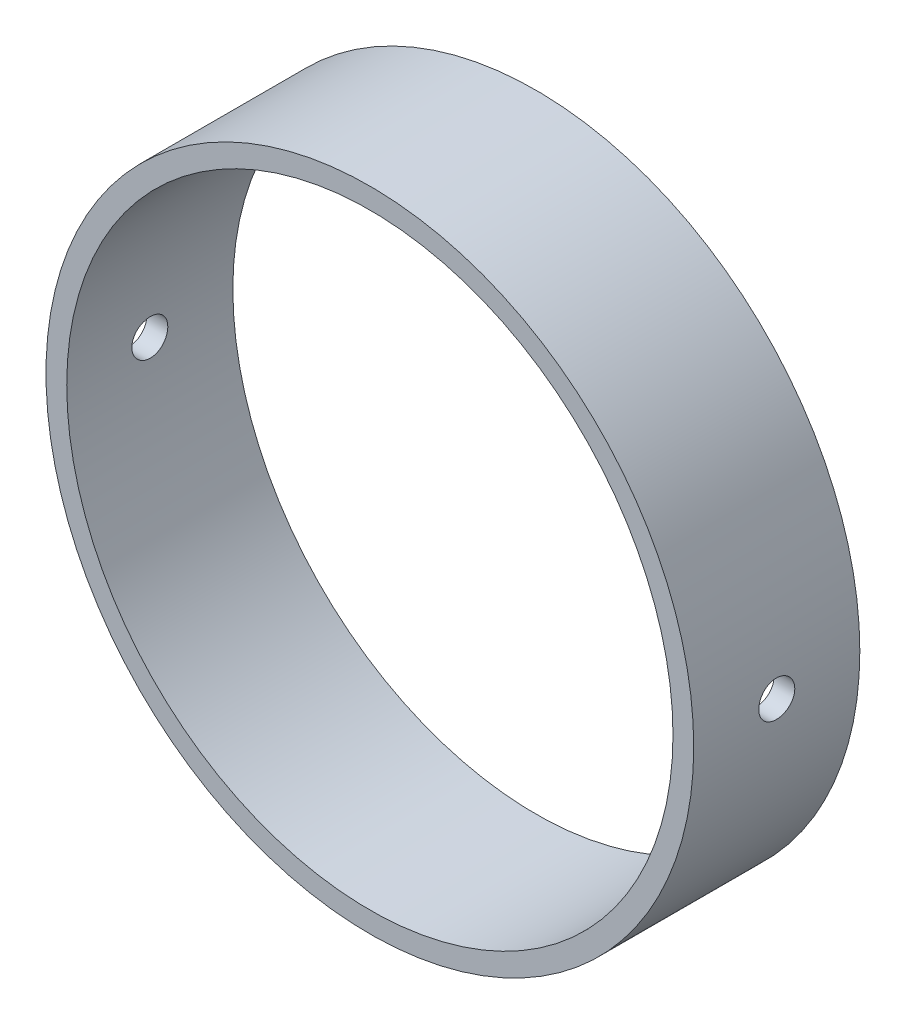
ISO-10303-21;
HEADER;
FILE_DESCRIPTION(('STEP AP214'),'2;1');
FILE_NAME('part.step','',(''),(''),'','','');
FILE_SCHEMA(('AUTOMOTIVE_DESIGN { 1 0 10303 214 1 1 1 1 }'));
ENDSEC;
DATA;
#1=APPLICATION_CONTEXT('core data for automotive mechanical design processes');
#2=APPLICATION_PROTOCOL_DEFINITION('international standard','automotive_design',2000,#1);
#3=PRODUCT_CONTEXT('',#1,'mechanical');
#4=PRODUCT('Part','Part','',(#3));
#5=PRODUCT_RELATED_PRODUCT_CATEGORY('part','',(#4));
#6=PRODUCT_DEFINITION_FORMATION('','',#4);
#7=PRODUCT_DEFINITION_CONTEXT('part definition',#1,'design');
#8=PRODUCT_DEFINITION('design','',#6,#7);
#9=PRODUCT_DEFINITION_SHAPE('','',#8);
#10=(LENGTH_UNIT() NAMED_UNIT(*) SI_UNIT(.MILLI.,.METRE.));
#11=(NAMED_UNIT(*) PLANE_ANGLE_UNIT() SI_UNIT($,.RADIAN.));
#12=(NAMED_UNIT(*) SI_UNIT($,.STERADIAN.) SOLID_ANGLE_UNIT());
#13=UNCERTAINTY_MEASURE_WITH_UNIT(LENGTH_MEASURE(1.E-05),#10,'distance_accuracy_value','');
#14=(GEOMETRIC_REPRESENTATION_CONTEXT(3) GLOBAL_UNCERTAINTY_ASSIGNED_CONTEXT((#13)) GLOBAL_UNIT_ASSIGNED_CONTEXT((#10,
#11,#12)) REPRESENTATION_CONTEXT('',''));
#15=CARTESIAN_POINT('',(0.,0.,0.));
#16=DIRECTION('',(0.,0.,1.));
#17=DIRECTION('',(1.,0.,0.));
#18=AXIS2_PLACEMENT_3D('',#15,#16,#17);
#19=CARTESIAN_POINT('',(0.,0.,30.));
#20=DIRECTION('',(0.,0.,1.));
#21=DIRECTION('',(1.,0.,0.));
#22=AXIS2_PLACEMENT_3D('',#19,#20,#21);
#23=PLANE('',#22);
#24=CARTESIAN_POINT('',(0.,0.,30.));
#25=DIRECTION('',(0.,0.,1.));
#26=DIRECTION('',(1.,0.,0.));
#27=AXIS2_PLACEMENT_3D('',#24,#25,#26);
#28=CIRCLE('',#27,58.5);
#29=CARTESIAN_POINT('',(58.5,0.,30.));
#30=VERTEX_POINT('',#29);
#31=EDGE_CURVE('E10',#30,#30,#28,.T.);
#32=ORIENTED_EDGE('',*,*,#31,.T.);
#33=EDGE_LOOP('',(#32));
#34=FACE_BOUND('',#33,.T.);
#35=CARTESIAN_POINT('',(0.,0.,30.));
#36=DIRECTION('',(0.,0.,1.));
#37=DIRECTION('',(1.,0.,0.));
#38=AXIS2_PLACEMENT_3D('',#35,#36,#37);
#39=CIRCLE('',#38,54.75);
#40=CARTESIAN_POINT('',(54.75,0.,30.));
#41=VERTEX_POINT('',#40);
#42=EDGE_CURVE('E51',#41,#41,#39,.T.);
#43=ORIENTED_EDGE('',*,*,#42,.F.);
#44=EDGE_LOOP('',(#43));
#45=FACE_BOUND('',#44,.T.);
#46=ADVANCED_FACE('F32',(#34,#45),#23,.T.);
#47=CARTESIAN_POINT('',(0.,0.,0.));
#48=DIRECTION('',(0.,0.,1.));
#49=DIRECTION('',(1.,0.,0.));
#50=AXIS2_PLACEMENT_3D('',#47,#48,#49);
#51=PLANE('',#50);
#52=CARTESIAN_POINT('',(0.,0.,0.));
#53=DIRECTION('',(0.,0.,1.));
#54=DIRECTION('',(1.,0.,0.));
#55=AXIS2_PLACEMENT_3D('',#52,#53,#54);
#56=CIRCLE('',#55,58.5);
#57=CARTESIAN_POINT('',(58.5,0.,0.));
#58=VERTEX_POINT('',#57);
#59=EDGE_CURVE('E46',#58,#58,#56,.T.);
#60=ORIENTED_EDGE('',*,*,#59,.F.);
#61=EDGE_LOOP('',(#60));
#62=FACE_BOUND('',#61,.T.);
#63=CARTESIAN_POINT('',(0.,0.,0.));
#64=DIRECTION('',(0.,0.,1.));
#65=DIRECTION('',(1.,0.,0.));
#66=AXIS2_PLACEMENT_3D('',#63,#64,#65);
#67=CIRCLE('',#66,54.75);
#68=CARTESIAN_POINT('',(54.75,0.,0.));
#69=VERTEX_POINT('',#68);
#70=EDGE_CURVE('E54',#69,#69,#67,.T.);
#71=ORIENTED_EDGE('',*,*,#70,.T.);
#72=EDGE_LOOP('',(#71));
#73=FACE_BOUND('',#72,.T.);
#74=ADVANCED_FACE('F90',(#62,#73),#51,.F.);
#75=CARTESIAN_POINT('',(0.,0.,30.));
#76=DIRECTION('',(0.,0.,-1.));
#77=DIRECTION('',(-1.,0.,0.));
#78=AXIS2_PLACEMENT_3D('',#75,#76,#77);
#79=CYLINDRICAL_SURFACE('',#78,58.5);
#80=CARTESIAN_POINT('',(-58.5,0.,11.75));
#81=CARTESIAN_POINT('',(-58.4999987953666,0.182402974439912,11.7500080400927));
#82=CARTESIAN_POINT('',(-58.4991377702473,0.364934620996883,11.7654073595226));
#83=CARTESIAN_POINT('',(-58.4957857467329,0.724960547987875,11.8266188070675));
#84=CARTESIAN_POINT('',(-58.4932928376346,0.902448668678453,11.8724665868982));
#85=CARTESIAN_POINT('',(-58.4869591430353,1.24712025143823,11.993256480855));
#86=CARTESIAN_POINT('',(-58.4831190546107,1.4143089902632,12.0681835504921));
#87=CARTESIAN_POINT('',(-58.4745232443111,1.7336916229769,12.2449814652546));
#88=CARTESIAN_POINT('',(-58.4697677359597,1.88588900114221,12.3468460292188));
#89=CARTESIAN_POINT('',(-58.4598694211132,2.17119793613013,12.5747639092333));
#90=CARTESIAN_POINT('',(-58.454726207185,2.30428897569389,12.7008428932852));
#91=CARTESIAN_POINT('',(-58.4446356493317,2.54743211917815,12.973558602729));
#92=CARTESIAN_POINT('',(-58.4396883134905,2.65748327305932,13.120196175429));
#93=CARTESIAN_POINT('',(-58.4305444006695,2.85148263605878,13.4299785210687));
#94=CARTESIAN_POINT('',(-58.4263483000833,2.93541430631404,13.593133666648));
#95=CARTESIAN_POINT('',(-58.4191851685758,3.07468623055521,13.9312469084939));
#96=CARTESIAN_POINT('',(-58.416218126708,3.1300267391865,14.1062048996236));
#97=CARTESIAN_POINT('',(-58.4118514867086,3.21048983031477,14.4627641194857));
#98=CARTESIAN_POINT('',(-58.410450258108,3.23564384779018,14.6443582341422));
#99=CARTESIAN_POINT('',(-58.4093683707329,3.25511693818751,15.0091963600235));
#100=CARTESIAN_POINT('',(-58.409687695918,3.24943629857731,15.1924403558506));
#101=CARTESIAN_POINT('',(-58.4120093914089,3.20742746485262,15.5551627343019));
#102=CARTESIAN_POINT('',(-58.4140098953931,3.17113325551565,15.7346450664891));
#103=CARTESIAN_POINT('',(-58.4194655462061,3.06898022779138,16.0849658027502));
#104=CARTESIAN_POINT('',(-58.4229207002551,3.0031212626577,16.2558041639146));
#105=CARTESIAN_POINT('',(-58.4308983975102,2.84366950092674,16.5840968515265));
#106=CARTESIAN_POINT('',(-58.4354215355038,2.750061242591,16.741543653169));
#107=CARTESIAN_POINT('',(-58.4450248281142,2.53777932543072,17.03850160148));
#108=CARTESIAN_POINT('',(-58.4501049876345,2.41910544594173,17.1780125902338));
#109=CARTESIAN_POINT('',(-58.4602580666854,2.15986937693775,17.4353364786589));
#110=CARTESIAN_POINT('',(-58.4653309670969,2.01927776550903,17.5531197405774));
#111=CARTESIAN_POINT('',(-58.4748911770744,1.720300404293,17.7634162662545));
#112=CARTESIAN_POINT('',(-58.4793784864732,1.56191464942173,17.8559295227933));
#113=CARTESIAN_POINT('',(-58.4872620801583,1.23182738484946,18.0130572250162));
#114=CARTESIAN_POINT('',(-58.4906583225575,1.06012536423844,18.0776705996303));
#115=CARTESIAN_POINT('',(-58.4959764539972,0.708287387723973,18.1771448523803));
#116=CARTESIAN_POINT('',(-58.4978983566518,0.528151509714866,18.2120060052479));
#117=CARTESIAN_POINT('',(-58.500049469333,0.164816446170672,18.2509496244157));
#118=CARTESIAN_POINT('',(-58.5002809334661,-0.0183783334535156,18.2550730778938));
#119=CARTESIAN_POINT('',(-58.4990310735761,-0.382857107348892,18.2325312658564));
#120=CARTESIAN_POINT('',(-58.4975497565708,-0.564141109446028,18.2058661264908));
#121=CARTESIAN_POINT('',(-58.4930425940845,-0.919537235663508,18.1225379836013));
#122=CARTESIAN_POINT('',(-58.4900177141674,-1.09365376984346,18.0658937324562));
#123=CARTESIAN_POINT('',(-58.4827638805693,-1.42990839462433,17.9242343130931));
#124=CARTESIAN_POINT('',(-58.478534918324,-1.59204640001307,17.839218943074));
#125=CARTESIAN_POINT('',(-58.4693428081674,-1.89992945506315,17.6431258713934));
#126=CARTESIAN_POINT('',(-58.464378889498,-2.04565700894337,17.5320207365055));
#127=CARTESIAN_POINT('',(-58.4542783131429,-2.31640648825586,17.2869420197741));
#128=CARTESIAN_POINT('',(-58.4491416541028,-2.44142825130491,17.1529682586022));
#129=CARTESIAN_POINT('',(-58.4392680697846,-2.66735558848317,16.8657787746388));
#130=CARTESIAN_POINT('',(-58.4345315882327,-2.76823461386642,16.7125421490516));
#131=CARTESIAN_POINT('',(-58.4259994958044,-2.94283138079033,16.3912821379659));
#132=CARTESIAN_POINT('',(-58.4222038801181,-3.0165492611877,16.2232588280673));
#133=CARTESIAN_POINT('',(-58.4159847273311,-3.1346849972725,15.8772927920754));
#134=CARTESIAN_POINT('',(-58.4135604019906,-3.1791196878404,15.6993558292627));
#135=CARTESIAN_POINT('',(-58.4103550152459,-3.23748273406569,15.338533066139));
#136=CARTESIAN_POINT('',(-58.4095739416076,-3.25141131684563,15.155647302683));
#137=CARTESIAN_POINT('',(-58.4097434366563,-3.24836462389653,14.7903825197515));
#138=CARTESIAN_POINT('',(-58.4106916658222,-3.2314311005925,14.6080031494574));
#139=CARTESIAN_POINT('',(-58.4142079523659,-3.16722729361361,14.2486811661158));
#140=CARTESIAN_POINT('',(-58.4167760127724,-3.11995695321907,14.0717385632338));
#141=CARTESIAN_POINT('',(-58.4232419912834,-2.99643028205423,13.7283052580689));
#142=CARTESIAN_POINT('',(-58.4271399120477,-2.92017389331311,13.5618145766901));
#143=CARTESIAN_POINT('',(-58.4358262125014,-2.74084621173277,13.243995170633));
#144=CARTESIAN_POINT('',(-58.4406145666469,-2.63777568807863,13.0926660112067));
#145=CARTESIAN_POINT('',(-58.4505495581838,-2.40759342326423,12.8092550991866));
#146=CARTESIAN_POINT('',(-58.4556966327923,-2.28045200829468,12.677197463535));
#147=CARTESIAN_POINT('',(-58.4657655691279,-2.00576736846978,12.4362573915093));
#148=CARTESIAN_POINT('',(-58.4706873752679,-1.85821914378212,12.3273806512927));
#149=CARTESIAN_POINT('',(-58.4797552778387,-1.54677178656003,12.1358299510865));
#150=CARTESIAN_POINT('',(-58.4839005356552,-1.38285526691391,12.0531842525835));
#151=CARTESIAN_POINT('',(-58.4909363119386,-1.04357106960759,11.9166867798997));
#152=CARTESIAN_POINT('',(-58.4938283064681,-0.868217144361602,11.8628011154324));
#153=CARTESIAN_POINT('',(-58.4972697082304,-0.576483861385596,11.7994339109725));
#154=CARTESIAN_POINT('',(-58.4982890469442,-0.461992535767632,11.7809199877311));
#155=CARTESIAN_POINT('',(-58.4996545750804,-0.231684779775788,11.7562004851618));
#156=CARTESIAN_POINT('',(-58.5000007652227,-0.115868350819313,11.7499948926694));
#157=CARTESIAN_POINT('',(-58.5,0.,11.75));
#158=B_SPLINE_CURVE_WITH_KNOTS('',3,(#80,#81,#82,#83,#84,#85,#86,#87,#88,#89,#90,#91,#92,#93,
#94,#95,#96,#97,#98,#99,#100,#101,#102,#103,#104,#105,#106,#107,#108,#109,#110,#111,#112,#113,
#114,#115,#116,#117,#118,#119,#120,#121,#122,#123,#124,#125,#126,#127,#128,#129,#130,#131,#132,
#133,#134,#135,#136,#137,#138,#139,#140,#141,#142,#143,#144,#145,#146,#147,#148,#149,#150,#151,
#152,#153,#154,#155,#156,#157),.UNSPECIFIED.,.T.,.F.,(4,2,2,2,2,2,2,2,2,2,2,2,2,2,2,2,2,2,2,2,2,
2,2,2,2,2,2,2,2,2,2,2,2,2,2,2,2,2,4),(0.,0.546785950021719,1.09421325619232,1.64135772158906,
2.18837471867706,2.73597480271135,3.28359746234378,3.83156617452386,4.37953000617106,
4.92692271413233,5.47431031882463,6.0210910553912,6.56787450596586,7.11496319546689,
7.66205670144767,8.20989104074716,8.75772553656856,9.30558106176402,9.85343152801367,
10.4005513322906,10.947668894864,11.4944446310673,12.0412242565182,12.588581412397,
13.1359428606695,13.6839034815481,14.2318613010328,14.7795038245911,15.3271422708549,
15.8740403832431,16.4209395181501,16.9678397468369,17.5147242889792,18.0622874549506,
18.6099850167421,19.1582706837685,19.7059088267078,20.0532455641526,20.4005819301013),.UNSPECIFIED.);
#159=CARTESIAN_POINT('',(-58.5,0.,11.75));
#160=VERTEX_POINT('',#159);
#161=EDGE_CURVE('E79',#160,#160,#158,.T.);
#162=ORIENTED_EDGE('',*,*,#161,.T.);
#163=EDGE_LOOP('',(#162));
#164=FACE_BOUND('',#163,.T.);
#165=CARTESIAN_POINT('',(58.5,0.,11.75));
#166=CARTESIAN_POINT('',(58.4999987953666,-0.182402974439912,11.7500080400927));
#167=CARTESIAN_POINT('',(58.4991377702473,-0.364934620996883,11.7654073595226));
#168=CARTESIAN_POINT('',(58.4957857467329,-0.724960547987875,11.8266188070675));
#169=CARTESIAN_POINT('',(58.4932928376346,-0.902448668678453,11.8724665868982));
#170=CARTESIAN_POINT('',(58.4869591430353,-1.24712025143823,11.993256480855));
#171=CARTESIAN_POINT('',(58.4831190546107,-1.4143089902632,12.0681835504921));
#172=CARTESIAN_POINT('',(58.4745232443111,-1.7336916229769,12.2449814652546));
#173=CARTESIAN_POINT('',(58.4697677359597,-1.88588900114221,12.3468460292188));
#174=CARTESIAN_POINT('',(58.4598694211132,-2.17119793613013,12.5747639092333));
#175=CARTESIAN_POINT('',(58.454726207185,-2.30428897569389,12.7008428932852));
#176=CARTESIAN_POINT('',(58.4446356493317,-2.54743211917815,12.973558602729));
#177=CARTESIAN_POINT('',(58.4396883134905,-2.65748327305932,13.120196175429));
#178=CARTESIAN_POINT('',(58.4305444006695,-2.85148263605878,13.4299785210687));
#179=CARTESIAN_POINT('',(58.4263483000833,-2.93541430631404,13.593133666648));
#180=CARTESIAN_POINT('',(58.4191851685758,-3.07468623055521,13.9312469084939));
#181=CARTESIAN_POINT('',(58.416218126708,-3.1300267391865,14.1062048996236));
#182=CARTESIAN_POINT('',(58.4118514867086,-3.21048983031477,14.4627641194857));
#183=CARTESIAN_POINT('',(58.410450258108,-3.23564384779018,14.6443582341422));
#184=CARTESIAN_POINT('',(58.4093683707329,-3.25511693818751,15.0091963600235));
#185=CARTESIAN_POINT('',(58.409687695918,-3.24943629857731,15.1924403558506));
#186=CARTESIAN_POINT('',(58.4120093914089,-3.20742746485262,15.5551627343019));
#187=CARTESIAN_POINT('',(58.4140098953931,-3.17113325551565,15.7346450664891));
#188=CARTESIAN_POINT('',(58.4194655462061,-3.06898022779138,16.0849658027502));
#189=CARTESIAN_POINT('',(58.4229207002551,-3.0031212626577,16.2558041639146));
#190=CARTESIAN_POINT('',(58.4308983975102,-2.84366950092674,16.5840968515265));
#191=CARTESIAN_POINT('',(58.4354215355038,-2.750061242591,16.741543653169));
#192=CARTESIAN_POINT('',(58.4450248281142,-2.53777932543072,17.03850160148));
#193=CARTESIAN_POINT('',(58.4501049876345,-2.41910544594173,17.1780125902338));
#194=CARTESIAN_POINT('',(58.4602580666854,-2.15986937693775,17.4353364786589));
#195=CARTESIAN_POINT('',(58.4653309670969,-2.01927776550903,17.5531197405774));
#196=CARTESIAN_POINT('',(58.4748911770744,-1.720300404293,17.7634162662545));
#197=CARTESIAN_POINT('',(58.4793784864732,-1.56191464942173,17.8559295227933));
#198=CARTESIAN_POINT('',(58.4872620801583,-1.23182738484946,18.0130572250162));
#199=CARTESIAN_POINT('',(58.4906583225575,-1.06012536423844,18.0776705996303));
#200=CARTESIAN_POINT('',(58.4959764539972,-0.708287387723973,18.1771448523803));
#201=CARTESIAN_POINT('',(58.4978983566518,-0.528151509714866,18.2120060052479));
#202=CARTESIAN_POINT('',(58.500049469333,-0.164816446170672,18.2509496244157));
#203=CARTESIAN_POINT('',(58.5002809334661,0.0183783334535156,18.2550730778938));
#204=CARTESIAN_POINT('',(58.4990310735761,0.382857107348892,18.2325312658564));
#205=CARTESIAN_POINT('',(58.4975497565708,0.564141109446028,18.2058661264908));
#206=CARTESIAN_POINT('',(58.4930425940845,0.919537235663508,18.1225379836013));
#207=CARTESIAN_POINT('',(58.4900177141674,1.09365376984346,18.0658937324562));
#208=CARTESIAN_POINT('',(58.4827638805693,1.42990839462433,17.9242343130931));
#209=CARTESIAN_POINT('',(58.478534918324,1.59204640001307,17.839218943074));
#210=CARTESIAN_POINT('',(58.4693428081674,1.89992945506315,17.6431258713934));
#211=CARTESIAN_POINT('',(58.464378889498,2.04565700894337,17.5320207365055));
#212=CARTESIAN_POINT('',(58.4542783131429,2.31640648825586,17.2869420197741));
#213=CARTESIAN_POINT('',(58.4491416541028,2.44142825130491,17.1529682586022));
#214=CARTESIAN_POINT('',(58.4392680697846,2.66735558848317,16.8657787746388));
#215=CARTESIAN_POINT('',(58.4345315882327,2.76823461386642,16.7125421490516));
#216=CARTESIAN_POINT('',(58.4259994958044,2.94283138079033,16.3912821379659));
#217=CARTESIAN_POINT('',(58.4222038801181,3.0165492611877,16.2232588280673));
#218=CARTESIAN_POINT('',(58.4159847273311,3.1346849972725,15.8772927920754));
#219=CARTESIAN_POINT('',(58.4135604019906,3.1791196878404,15.6993558292627));
#220=CARTESIAN_POINT('',(58.4103550152459,3.23748273406569,15.338533066139));
#221=CARTESIAN_POINT('',(58.4095739416076,3.25141131684563,15.155647302683));
#222=CARTESIAN_POINT('',(58.4097434366563,3.24836462389653,14.7903825197515));
#223=CARTESIAN_POINT('',(58.4106916658222,3.2314311005925,14.6080031494574));
#224=CARTESIAN_POINT('',(58.4142079523659,3.16722729361361,14.2486811661158));
#225=CARTESIAN_POINT('',(58.4167760127724,3.11995695321907,14.0717385632338));
#226=CARTESIAN_POINT('',(58.4232419912834,2.99643028205423,13.7283052580689));
#227=CARTESIAN_POINT('',(58.4271399120477,2.92017389331311,13.5618145766901));
#228=CARTESIAN_POINT('',(58.4358262125014,2.74084621173277,13.243995170633));
#229=CARTESIAN_POINT('',(58.4406145666469,2.63777568807863,13.0926660112067));
#230=CARTESIAN_POINT('',(58.4505495581838,2.40759342326423,12.8092550991866));
#231=CARTESIAN_POINT('',(58.4556966327923,2.28045200829468,12.677197463535));
#232=CARTESIAN_POINT('',(58.4657655691279,2.00576736846978,12.4362573915093));
#233=CARTESIAN_POINT('',(58.4706873752679,1.85821914378212,12.3273806512927));
#234=CARTESIAN_POINT('',(58.4797552778387,1.54677178656003,12.1358299510865));
#235=CARTESIAN_POINT('',(58.4839005356552,1.38285526691391,12.0531842525835));
#236=CARTESIAN_POINT('',(58.4909363119386,1.04357106960759,11.9166867798997));
#237=CARTESIAN_POINT('',(58.4938283064681,0.868217144361602,11.8628011154324));
#238=CARTESIAN_POINT('',(58.4972697082304,0.576483861385596,11.7994339109725));
#239=CARTESIAN_POINT('',(58.4982890469442,0.461992535767632,11.7809199877311));
#240=CARTESIAN_POINT('',(58.4996545750804,0.231684779775788,11.7562004851618));
#241=CARTESIAN_POINT('',(58.5000007652227,0.115868350819313,11.7499948926694));
#242=CARTESIAN_POINT('',(58.5,0.,11.75));
#243=B_SPLINE_CURVE_WITH_KNOTS('',3,(#165,#166,#167,#168,#169,#170,#171,#172,#173,#174,#175,
#176,#177,#178,#179,#180,#181,#182,#183,#184,#185,#186,#187,#188,#189,#190,#191,#192,#193,#194,
#195,#196,#197,#198,#199,#200,#201,#202,#203,#204,#205,#206,#207,#208,#209,#210,#211,#212,#213,
#214,#215,#216,#217,#218,#219,#220,#221,#222,#223,#224,#225,#226,#227,#228,#229,#230,#231,#232,
#233,#234,#235,#236,#237,#238,#239,#240,#241,#242),.UNSPECIFIED.,.T.,.F.,(4,2,2,2,2,2,2,2,2,2,2,
2,2,2,2,2,2,2,2,2,2,2,2,2,2,2,2,2,2,2,2,2,2,2,2,2,2,2,4),(0.,0.546785950021719,1.09421325619232,
1.64135772158906,2.18837471867706,2.73597480271135,3.28359746234378,3.83156617452386,
4.37953000617106,4.92692271413233,5.47431031882463,6.0210910553912,6.56787450596586,
7.11496319546689,7.66205670144767,8.20989104074716,8.75772553656856,9.30558106176402,
9.85343152801367,10.4005513322906,10.947668894864,11.4944446310673,12.0412242565182,
12.588581412397,13.1359428606695,13.6839034815481,14.2318613010328,14.7795038245911,
15.3271422708549,15.8740403832431,16.4209395181501,16.9678397468369,17.5147242889792,
18.0622874549506,18.6099850167421,19.1582706837685,19.7059088267078,20.0532455641526,
20.4005819301013),.UNSPECIFIED.);
#244=CARTESIAN_POINT('',(58.5,0.,11.75));
#245=VERTEX_POINT('',#244);
#246=EDGE_CURVE('E74',#245,#245,#243,.T.);
#247=ORIENTED_EDGE('',*,*,#246,.T.);
#248=EDGE_LOOP('',(#247));
#249=FACE_BOUND('',#248,.T.);
#250=ORIENTED_EDGE('',*,*,#31,.F.);
#251=EDGE_LOOP('',(#250));
#252=FACE_BOUND('',#251,.T.);
#253=ORIENTED_EDGE('',*,*,#59,.T.);
#254=EDGE_LOOP('',(#253));
#255=FACE_BOUND('',#254,.T.);
#256=ADVANCED_FACE('F34',(#164,#249,#252,#255),#79,.T.);
#257=CARTESIAN_POINT('',(0.,0.,30.));
#258=DIRECTION('',(0.,0.,-1.));
#259=DIRECTION('',(-1.,0.,0.));
#260=AXIS2_PLACEMENT_3D('',#257,#258,#259);
#261=CYLINDRICAL_SURFACE('',#260,54.75);
#262=CARTESIAN_POINT('',(-54.75,0.,18.25));
#263=CARTESIAN_POINT('',(-54.7499987154161,-0.182381617175561,18.249991968433));
#264=CARTESIAN_POINT('',(-54.7490789335664,-0.364891382312879,18.2345962403011));
#265=CARTESIAN_POINT('',(-54.7454981673048,-0.724872685475404,18.1733998899075));
#266=CARTESIAN_POINT('',(-54.7428351495571,-0.902338087145863,18.1275637606098));
#267=CARTESIAN_POINT('',(-54.7360692111221,-1.24696412256613,18.0068066256154));
#268=CARTESIAN_POINT('',(-54.7319670431055,-1.41413008926294,17.9319008210895));
#269=CARTESIAN_POINT('',(-54.7227843528725,-1.73347166895354,17.7551549348116));
#270=CARTESIAN_POINT('',(-54.7177040566623,-1.88565073256767,17.6533210730315));
#271=CARTESIAN_POINT('',(-54.7071285263116,-2.17095059187311,17.4254569038112));
#272=CARTESIAN_POINT('',(-54.7016328008824,-2.30404826576444,17.2993976669039));
#273=CARTESIAN_POINT('',(-54.6908500169832,-2.54720961090636,17.0267203405194));
#274=CARTESIAN_POINT('',(-54.6855629671862,-2.65727232559306,16.8801013976891));
#275=CARTESIAN_POINT('',(-54.6757900333965,-2.8513091560238,16.5703377159431));
#276=CARTESIAN_POINT('',(-54.6713047328754,-2.93526430463475,16.40718107597));
#277=CARTESIAN_POINT('',(-54.6636473853966,-3.07458139505564,16.0690569307504));
#278=CARTESIAN_POINT('',(-54.6604753254492,-3.12994361968757,15.8940895423472));
#279=CARTESIAN_POINT('',(-54.655806801515,-3.21043979922308,15.5375312693997));
#280=CARTESIAN_POINT('',(-54.6543083484196,-3.23560964089705,15.3559485130733));
#281=CARTESIAN_POINT('',(-54.6531500580414,-3.25511734276083,14.9911296101604));
#282=CARTESIAN_POINT('',(-54.6534902016541,-3.2494555233188,14.8078934807738));
#283=CARTESIAN_POINT('',(-54.6559688996052,-3.20749042785043,14.445213598022));
#284=CARTESIAN_POINT('',(-54.6581051756693,-3.1712259690196,14.2657653354504));
#285=CARTESIAN_POINT('',(-54.6639317961727,-3.06914520380794,13.9155077402015));
#286=CARTESIAN_POINT('',(-54.6676221491789,-3.00332873452297,13.744698455152));
#287=CARTESIAN_POINT('',(-54.6761436526376,-2.84396809730327,13.4164426588945));
#288=CARTESIAN_POINT('',(-54.6809755281522,-2.75040629665653,13.2590047275471));
#289=CARTESIAN_POINT('',(-54.6912348048907,-2.53822366730589,12.9620545340589));
#290=CARTESIAN_POINT('',(-54.6966622121319,-2.41960258538843,12.8225424530743));
#291=CARTESIAN_POINT('',(-54.7075110145871,-2.16044986992732,12.5651783289246));
#292=CARTESIAN_POINT('',(-54.7129323875247,-2.01988463703768,12.447360115012));
#293=CARTESIAN_POINT('',(-54.7231500721757,-1.72095161836881,12.2369890207723));
#294=CARTESIAN_POINT('',(-54.72794638369,-1.56258382691968,12.144436148492));
#295=CARTESIAN_POINT('',(-54.73637378429,-1.23252085075702,11.9872259402375));
#296=CARTESIAN_POINT('',(-54.7400048209982,-1.06082506739945,11.9225698581404));
#297=CARTESIAN_POINT('',(-54.7456917710374,-0.708988979635843,11.8230110450183));
#298=CARTESIAN_POINT('',(-54.7477477009666,-0.528848764236494,11.7881080004623));
#299=CARTESIAN_POINT('',(-54.7500506193371,-0.16553089149501,11.7490878890597));
#300=CARTESIAN_POINT('',(-54.7503003563486,0.017641725322396,11.7449240447013));
#301=CARTESIAN_POINT('',(-54.7489700532934,0.382082875187445,11.767378348));
#302=CARTESIAN_POINT('',(-54.7473900218031,0.563351417155934,11.7939963513751));
#303=CARTESIAN_POINT('',(-54.7425798475817,0.918707282924349,11.8772200351891));
#304=CARTESIAN_POINT('',(-54.7393508843184,1.09279964372749,11.9338042820803));
#305=CARTESIAN_POINT('',(-54.7316061882838,1.42901668907871,12.0753324759818));
#306=CARTESIAN_POINT('',(-54.7270904450657,1.59114127645299,12.1602766532332));
#307=CARTESIAN_POINT('',(-54.7172729069907,1.89903502056385,12.356232719071));
#308=CARTESIAN_POINT('',(-54.7119701719584,2.04478424353193,12.4672758805655));
#309=CARTESIAN_POINT('',(-54.7011786812385,2.31558937008375,12.7122322410373));
#310=CARTESIAN_POINT('',(-54.6956899238939,2.44064508928626,12.8461456437692));
#311=CARTESIAN_POINT('',(-54.685137084675,2.66667152900025,13.1332428341708));
#312=CARTESIAN_POINT('',(-54.6800735426381,2.76761192465475,13.2864505185949));
#313=CARTESIAN_POINT('',(-54.6709507144403,2.94233500734699,13.6076669926864));
#314=CARTESIAN_POINT('',(-54.6668914225794,3.0161178485288,13.7756756983377));
#315=CARTESIAN_POINT('',(-54.6602387469866,3.13437878633053,14.1216138700369));
#316=CARTESIAN_POINT('',(-54.6576444053186,3.1788760360641,14.2995367693228));
#317=CARTESIAN_POINT('',(-54.6542115287701,3.23736525459225,14.6603441509132));
#318=CARTESIAN_POINT('',(-54.6533729784974,3.25135749081254,14.8432285897075));
#319=CARTESIAN_POINT('',(-54.653546620673,3.24843694782579,15.2084660290485));
#320=CARTESIAN_POINT('',(-54.6545559576777,3.2315718508679,15.3908194141529));
#321=CARTESIAN_POINT('',(-54.6583055832533,3.16751416035726,15.7501004870423));
#322=CARTESIAN_POINT('',(-54.6610458750091,3.1203215110057,15.927028164844));
#323=CARTESIAN_POINT('',(-54.6679479057893,2.99695883881404,16.2704433643701));
#324=CARTESIAN_POINT('',(-54.67210964105,2.92078889269909,16.4369309137362));
#325=CARTESIAN_POINT('',(-54.6813854608003,2.74164071538154,16.754760007007));
#326=CARTESIAN_POINT('',(-54.6864995193855,2.63866321334913,16.9061019627194));
#327=CARTESIAN_POINT('',(-54.697112830754,2.40864786829197,17.1895849049101));
#328=CARTESIAN_POINT('',(-54.7026126243871,2.28157579879042,17.3216980991042));
#329=CARTESIAN_POINT('',(-54.7133731719357,2.00701979880443,17.5627617277084));
#330=CARTESIAN_POINT('',(-54.7186338669499,1.85953087449225,17.6717064786854));
#331=CARTESIAN_POINT('',(-54.7283283848966,1.54817419459197,17.8634128732498));
#332=CARTESIAN_POINT('',(-54.7327612409975,1.3842876269111,17.9461439795228));
#333=CARTESIAN_POINT('',(-54.7402872577977,1.04504410576319,18.0828150901318));
#334=CARTESIAN_POINT('',(-54.7433819903416,0.869700890360575,18.136788892029));
#335=CARTESIAN_POINT('',(-54.7470700075731,0.577733636483393,18.2003498886062));
#336=CARTESIAN_POINT('',(-54.7481638864658,0.462997931640118,18.2189446879422));
#337=CARTESIAN_POINT('',(-54.7496292911793,0.232192133167311,18.2437722928479));
#338=CARTESIAN_POINT('',(-54.7500008178922,0.116122041185863,18.250005113684));
#339=CARTESIAN_POINT('',(-54.75,0.,18.25));
#340=B_SPLINE_CURVE_WITH_KNOTS('',3,(#262,#263,#264,#265,#266,#267,#268,#269,#270,#271,#272,
#273,#274,#275,#276,#277,#278,#279,#280,#281,#282,#283,#284,#285,#286,#287,#288,#289,#290,#291,
#292,#293,#294,#295,#296,#297,#298,#299,#300,#301,#302,#303,#304,#305,#306,#307,#308,#309,#310,
#311,#312,#313,#314,#315,#316,#317,#318,#319,#320,#321,#322,#323,#324,#325,#326,#327,#328,#329,
#330,#331,#332,#333,#334,#335,#336,#337,#338,#339),.UNSPECIFIED.,.T.,.F.,(4,2,2,2,2,2,2,2,2,2,2,
2,2,2,2,2,2,2,2,2,2,2,2,2,2,2,2,2,2,2,2,2,2,2,2,2,2,2,4),(0.,0.546720944147138,1.09408073061192,
1.64115467547951,2.18810236480001,2.73570731328123,3.2833349974326,3.83135960832118,
4.37937879841461,4.92674596352118,5.47410744101072,6.02077567252875,6.56744691756822,
7.11446633037759,7.66149127085414,8.20936214425365,8.75723319214394,9.30512886262817,
9.85301875943663,10.4000747302094,10.9471281368074,11.4937907873675,12.0404578761341,
12.5877833744399,13.1351137492097,13.6831288076116,14.2311407554768,14.7787939401253,
15.3264423236896,15.8732451689919,16.4200490203441,16.9668514238967,17.5136389558824,
18.0612091019286,18.6089134174409,19.1572534493903,19.7049476048965,20.053044257286,
20.4011404797924),.UNSPECIFIED.);
#341=CARTESIAN_POINT('',(-54.75,0.,18.25));
#342=VERTEX_POINT('',#341);
#343=EDGE_CURVE('E37',#342,#342,#340,.T.);
#344=ORIENTED_EDGE('',*,*,#343,.F.);
#345=EDGE_LOOP('',(#344));
#346=FACE_BOUND('',#345,.T.);
#347=CARTESIAN_POINT('',(54.75,0.,11.75));
#348=CARTESIAN_POINT('',(54.7499987154161,-0.182381617175561,11.750008031567));
#349=CARTESIAN_POINT('',(54.7490789335664,-0.364891382312878,11.765403759699));
#350=CARTESIAN_POINT('',(54.7454981673048,-0.724872685475403,11.8266001100925));
#351=CARTESIAN_POINT('',(54.7428351495571,-0.902338087145863,11.8724362393902));
#352=CARTESIAN_POINT('',(54.7360692111221,-1.24696412256613,11.9931933743846));
#353=CARTESIAN_POINT('',(54.7319670431055,-1.41413008926294,12.0680991789105));
#354=CARTESIAN_POINT('',(54.7227843528725,-1.73347166895353,12.2448450651884));
#355=CARTESIAN_POINT('',(54.7177040566623,-1.88565073256766,12.3466789269685));
#356=CARTESIAN_POINT('',(54.7071285263116,-2.17095059187311,12.5745430961887));
#357=CARTESIAN_POINT('',(54.7016328008824,-2.30404826576444,12.700602333096));
#358=CARTESIAN_POINT('',(54.6908500169832,-2.54720961090636,12.9732796594806));
#359=CARTESIAN_POINT('',(54.6855629671862,-2.65727232559306,13.1198986023109));
#360=CARTESIAN_POINT('',(54.6757900333965,-2.8513091560238,13.4296622840569));
#361=CARTESIAN_POINT('',(54.6713047328754,-2.93526430463475,13.59281892403));
#362=CARTESIAN_POINT('',(54.6636473853966,-3.07458139505563,13.9309430692496));
#363=CARTESIAN_POINT('',(54.6604753254492,-3.12994361968757,14.1059104576528));
#364=CARTESIAN_POINT('',(54.655806801515,-3.21043979922308,14.4624687306003));
#365=CARTESIAN_POINT('',(54.6543083484196,-3.23560964089705,14.6440514869267));
#366=CARTESIAN_POINT('',(54.6531500580414,-3.25511734276083,15.0088703898396));
#367=CARTESIAN_POINT('',(54.6534902016541,-3.2494555233188,15.1921065192262));
#368=CARTESIAN_POINT('',(54.6559688996052,-3.20749042785044,15.554786401978));
#369=CARTESIAN_POINT('',(54.6581051756693,-3.1712259690196,15.7342346645496));
#370=CARTESIAN_POINT('',(54.6639317961727,-3.06914520380794,16.0844922597985));
#371=CARTESIAN_POINT('',(54.6676221491789,-3.00332873452297,16.255301544848));
#372=CARTESIAN_POINT('',(54.6761436526376,-2.84396809730327,16.5835573411055));
#373=CARTESIAN_POINT('',(54.6809755281522,-2.75040629665653,16.7409952724529));
#374=CARTESIAN_POINT('',(54.6912348048907,-2.5382236673059,17.0379454659411));
#375=CARTESIAN_POINT('',(54.6966622121319,-2.41960258538843,17.1774575469257));
#376=CARTESIAN_POINT('',(54.7075110145871,-2.16044986992732,17.4348216710754));
#377=CARTESIAN_POINT('',(54.7129323875247,-2.01988463703768,17.552639884988));
#378=CARTESIAN_POINT('',(54.7231500721757,-1.72095161836881,17.7630109792277));
#379=CARTESIAN_POINT('',(54.72794638369,-1.56258382691968,17.855563851508));
#380=CARTESIAN_POINT('',(54.73637378429,-1.23252085075703,18.0127740597625));
#381=CARTESIAN_POINT('',(54.7400048209982,-1.06082506739945,18.0774301418596));
#382=CARTESIAN_POINT('',(54.7456917710374,-0.708988979635845,18.1769889549817));
#383=CARTESIAN_POINT('',(54.7477477009666,-0.528848764236496,18.2118919995377));
#384=CARTESIAN_POINT('',(54.7500506193371,-0.165530891495011,18.2509121109403));
#385=CARTESIAN_POINT('',(54.7503003563486,0.0176417253223952,18.2550759552987));
#386=CARTESIAN_POINT('',(54.7489700532934,0.382082875187444,18.232621652));
#387=CARTESIAN_POINT('',(54.7473900218031,0.563351417155932,18.2060036486249));
#388=CARTESIAN_POINT('',(54.7425798475817,0.918707282924346,18.1227799648109));
#389=CARTESIAN_POINT('',(54.7393508843184,1.09279964372748,18.0661957179197));
#390=CARTESIAN_POINT('',(54.7316061882838,1.42901668907871,17.9246675240182));
#391=CARTESIAN_POINT('',(54.7270904450657,1.59114127645299,17.8397233467668));
#392=CARTESIAN_POINT('',(54.7172729069907,1.89903502056385,17.643767280929));
#393=CARTESIAN_POINT('',(54.7119701719584,2.04478424353193,17.5327241194345));
#394=CARTESIAN_POINT('',(54.7011786812385,2.31558937008375,17.2877677589627));
#395=CARTESIAN_POINT('',(54.6956899238939,2.44064508928626,17.1538543562308));
#396=CARTESIAN_POINT('',(54.685137084675,2.66667152900025,16.8667571658292));
#397=CARTESIAN_POINT('',(54.6800735426381,2.76761192465475,16.7135494814051));
#398=CARTESIAN_POINT('',(54.6709507144403,2.94233500734699,16.3923330073136));
#399=CARTESIAN_POINT('',(54.6668914225794,3.0161178485288,16.2243243016623));
#400=CARTESIAN_POINT('',(54.6602387469866,3.13437878633053,15.8783861299631));
#401=CARTESIAN_POINT('',(54.6576444053186,3.1788760360641,15.7004632306772));
#402=CARTESIAN_POINT('',(54.6542115287701,3.23736525459225,15.3396558490868));
#403=CARTESIAN_POINT('',(54.6533729784974,3.25135749081254,15.1567714102925));
#404=CARTESIAN_POINT('',(54.653546620673,3.24843694782579,14.7915339709515));
#405=CARTESIAN_POINT('',(54.6545559576777,3.2315718508679,14.6091805858471));
#406=CARTESIAN_POINT('',(54.6583055832533,3.16751416035726,14.2498995129577));
#407=CARTESIAN_POINT('',(54.6610458750091,3.1203215110057,14.072971835156));
#408=CARTESIAN_POINT('',(54.6679479057893,2.99695883881404,13.7295566356299));
#409=CARTESIAN_POINT('',(54.67210964105,2.92078889269909,13.5630690862638));
#410=CARTESIAN_POINT('',(54.6813854608003,2.74164071538154,13.245239992993));
#411=CARTESIAN_POINT('',(54.6864995193855,2.63866321334913,13.0938980372806));
#412=CARTESIAN_POINT('',(54.697112830754,2.40864786829197,12.8104150950899));
#413=CARTESIAN_POINT('',(54.7026126243871,2.28157579879043,12.6783019008958));
#414=CARTESIAN_POINT('',(54.7133731719357,2.00701979880443,12.4372382722916));
#415=CARTESIAN_POINT('',(54.7186338669499,1.85953087449225,12.3282935213146));
#416=CARTESIAN_POINT('',(54.7283283848966,1.54817419459197,12.1365871267502));
#417=CARTESIAN_POINT('',(54.7327612409975,1.38428762691109,12.0538560204772));
#418=CARTESIAN_POINT('',(54.7402872577977,1.04504410576319,11.9171849098682));
#419=CARTESIAN_POINT('',(54.7433819903416,0.869700890360575,11.863211107971));
#420=CARTESIAN_POINT('',(54.7470700075731,0.577733636483392,11.7996501113938));
#421=CARTESIAN_POINT('',(54.7481638864658,0.462997931640117,11.7810553120578));
#422=CARTESIAN_POINT('',(54.7496292911793,0.232192133167311,11.7562277071521));
#423=CARTESIAN_POINT('',(54.7500008178922,0.116122041185863,11.749994886316));
#424=CARTESIAN_POINT('',(54.75,0.,11.75));
#425=B_SPLINE_CURVE_WITH_KNOTS('',3,(#347,#348,#349,#350,#351,#352,#353,#354,#355,#356,#357,
#358,#359,#360,#361,#362,#363,#364,#365,#366,#367,#368,#369,#370,#371,#372,#373,#374,#375,#376,
#377,#378,#379,#380,#381,#382,#383,#384,#385,#386,#387,#388,#389,#390,#391,#392,#393,#394,#395,
#396,#397,#398,#399,#400,#401,#402,#403,#404,#405,#406,#407,#408,#409,#410,#411,#412,#413,#414,
#415,#416,#417,#418,#419,#420,#421,#422,#423,#424),.UNSPECIFIED.,.T.,.F.,(4,2,2,2,2,2,2,2,2,2,2,
2,2,2,2,2,2,2,2,2,2,2,2,2,2,2,2,2,2,2,2,2,2,2,2,2,2,2,4),(0.,0.546720944147137,1.09408073061192,
1.64115467547951,2.18810236480001,2.73570731328123,3.2833349974326,3.83135960832118,
4.3793787984146,4.92674596352118,5.47410744101072,6.02077567252874,6.56744691756821,
7.11446633037758,7.66149127085414,8.20936214425364,8.75723319214394,9.30512886262816,
9.85301875943662,10.4000747302094,10.9471281368074,11.4937907873675,12.0404578761341,
12.5877833744399,13.1351137492097,13.6831288076116,14.2311407554768,14.7787939401253,
15.3264423236896,15.8732451689919,16.4200490203441,16.9668514238967,17.5136389558824,
18.0612091019286,18.6089134174409,19.1572534493903,19.7049476048965,20.053044257286,
20.4011404797924),.UNSPECIFIED.);
#426=CARTESIAN_POINT('',(54.75,0.,11.75));
#427=VERTEX_POINT('',#426);
#428=EDGE_CURVE('E56',#427,#427,#425,.T.);
#429=ORIENTED_EDGE('',*,*,#428,.F.);
#430=EDGE_LOOP('',(#429));
#431=FACE_BOUND('',#430,.T.);
#432=ORIENTED_EDGE('',*,*,#42,.T.);
#433=EDGE_LOOP('',(#432));
#434=FACE_BOUND('',#433,.T.);
#435=ORIENTED_EDGE('',*,*,#70,.F.);
#436=EDGE_LOOP('',(#435));
#437=FACE_BOUND('',#436,.T.);
#438=ADVANCED_FACE('F61',(#346,#431,#434,#437),#261,.F.);
#439=CARTESIAN_POINT('',(-58.5,0.,15.));
#440=DIRECTION('',(1.,0.,0.));
#441=DIRECTION('',(0.,0.,-1.));
#442=AXIS2_PLACEMENT_3D('',#439,#440,#441);
#443=CYLINDRICAL_SURFACE('',#442,3.25);
#444=ORIENTED_EDGE('',*,*,#428,.T.);
#445=EDGE_LOOP('',(#444));
#446=FACE_BOUND('',#445,.T.);
#447=ORIENTED_EDGE('',*,*,#246,.F.);
#448=EDGE_LOOP('',(#447));
#449=FACE_BOUND('',#448,.T.);
#450=ADVANCED_FACE('F67',(#446,#449),#443,.F.);
#451=ORIENTED_EDGE('',*,*,#343,.T.);
#452=EDGE_LOOP('',(#451));
#453=FACE_BOUND('',#452,.T.);
#454=ORIENTED_EDGE('',*,*,#161,.F.);
#455=EDGE_LOOP('',(#454));
#456=FACE_BOUND('',#455,.T.);
#457=ADVANCED_FACE('F64',(#453,#456),#443,.F.);
#458=CLOSED_SHELL('',(#46,#74,#256,#438,#450,#457));
#459=MANIFOLD_SOLID_BREP('B2',#458);
#460=ADVANCED_BREP_SHAPE_REPRESENTATION('',(#18,#459),#14);
#461=SHAPE_DEFINITION_REPRESENTATION(#9,#460);
ENDSEC;
END-ISO-10303-21;
